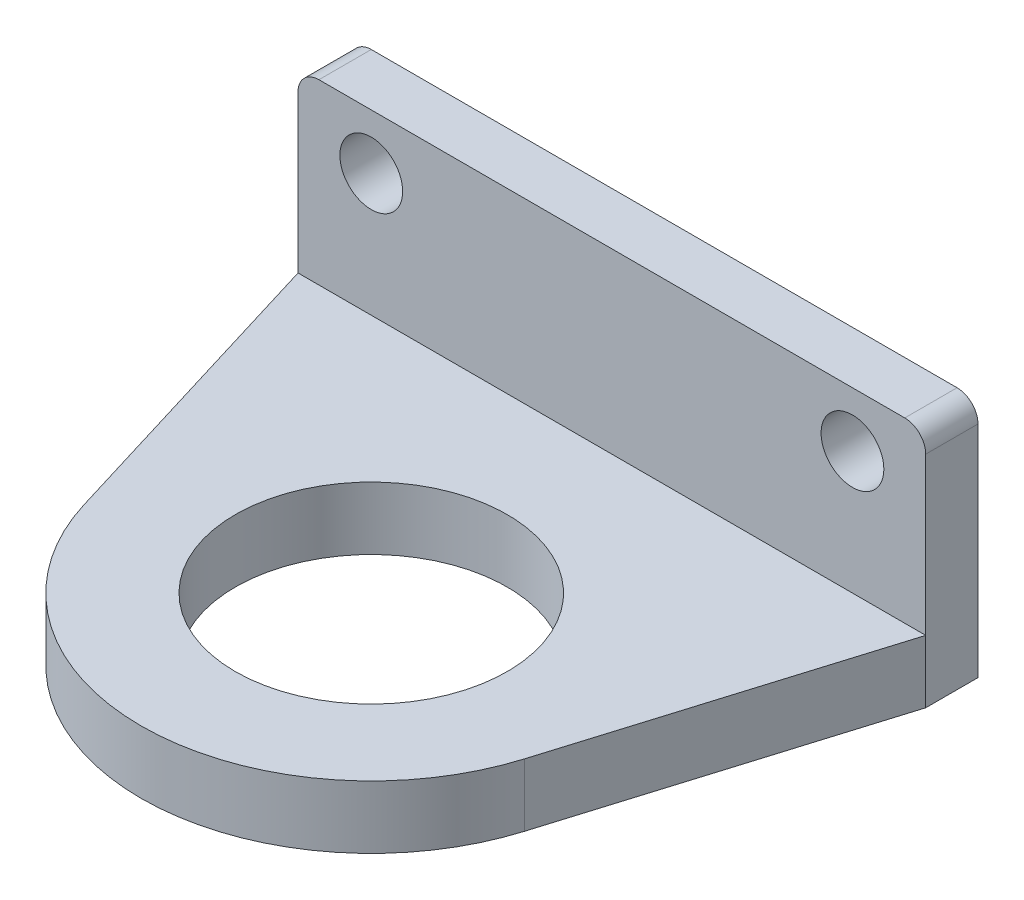
ISO-10303-21;
HEADER;
FILE_DESCRIPTION(('STEP AP214'),'2;1');
FILE_NAME('part.step','',(''),(''),'','','');
FILE_SCHEMA(('AUTOMOTIVE_DESIGN { 1 0 10303 214 1 1 1 1 }'));
ENDSEC;
DATA;
#1=APPLICATION_CONTEXT('core data for automotive mechanical design processes');
#2=APPLICATION_PROTOCOL_DEFINITION('international standard','automotive_design',2000,#1);
#3=PRODUCT_CONTEXT('',#1,'mechanical');
#4=PRODUCT('Part','Part','',(#3));
#5=PRODUCT_RELATED_PRODUCT_CATEGORY('part','',(#4));
#6=PRODUCT_DEFINITION_FORMATION('','',#4);
#7=PRODUCT_DEFINITION_CONTEXT('part definition',#1,'design');
#8=PRODUCT_DEFINITION('design','',#6,#7);
#9=PRODUCT_DEFINITION_SHAPE('','',#8);
#10=(LENGTH_UNIT() NAMED_UNIT(*) SI_UNIT(.MILLI.,.METRE.));
#11=(NAMED_UNIT(*) PLANE_ANGLE_UNIT() SI_UNIT($,.RADIAN.));
#12=(NAMED_UNIT(*) SI_UNIT($,.STERADIAN.) SOLID_ANGLE_UNIT());
#13=UNCERTAINTY_MEASURE_WITH_UNIT(LENGTH_MEASURE(1.E-05),#10,'distance_accuracy_value','');
#14=(GEOMETRIC_REPRESENTATION_CONTEXT(3) GLOBAL_UNCERTAINTY_ASSIGNED_CONTEXT((#13)) GLOBAL_UNIT_ASSIGNED_CONTEXT((#10,
#11,#12)) REPRESENTATION_CONTEXT('',''));
#15=CARTESIAN_POINT('',(0.,0.,0.));
#16=DIRECTION('',(0.,0.,1.));
#17=DIRECTION('',(1.,0.,0.));
#18=AXIS2_PLACEMENT_3D('',#15,#16,#17);
#19=CARTESIAN_POINT('',(-15.,-3.,0.));
#20=DIRECTION('',(-1.,0.,0.));
#21=DIRECTION('',(0.,0.,1.));
#22=AXIS2_PLACEMENT_3D('',#19,#20,#21);
#23=PLANE('',#22);
#24=DIRECTION('',(0.,-1.,0.));
#25=VECTOR('',#24,1.);
#26=CARTESIAN_POINT('',(-15.,8.5,2.5));
#27=LINE('',#26,#25);
#28=CARTESIAN_POINT('',(-15.,7.5,2.5));
#29=VERTEX_POINT('',#28);
#30=CARTESIAN_POINT('',(-15.,0.,2.5));
#31=VERTEX_POINT('',#30);
#32=EDGE_CURVE('E110',#29,#31,#27,.T.);
#33=ORIENTED_EDGE('',*,*,#32,.F.);
#34=DIRECTION('',(0.,0.,1.));
#35=VECTOR('',#34,1.);
#36=CARTESIAN_POINT('',(-15.,7.5,0.));
#37=LINE('',#36,#35);
#38=CARTESIAN_POINT('',(-15.,7.5,0.));
#39=VERTEX_POINT('',#38);
#40=EDGE_CURVE('E11',#29,#39,#37,.F.);
#41=ORIENTED_EDGE('',*,*,#40,.T.);
#42=DIRECTION('',(0.,1.,0.));
#43=VECTOR('',#42,1.);
#44=CARTESIAN_POINT('',(-15.,-3.,0.));
#45=LINE('',#44,#43);
#46=CARTESIAN_POINT('',(-15.,-3.,0.));
#47=VERTEX_POINT('',#46);
#48=EDGE_CURVE('E171',#47,#39,#45,.T.);
#49=ORIENTED_EDGE('',*,*,#48,.F.);
#50=DIRECTION('',(0.,0.,1.));
#51=VECTOR('',#50,1.);
#52=CARTESIAN_POINT('',(-15.,-3.,0.));
#53=LINE('',#52,#51);
#54=CARTESIAN_POINT('',(-15.,-3.,2.5));
#55=VERTEX_POINT('',#54);
#56=EDGE_CURVE('E126',#47,#55,#53,.T.);
#57=ORIENTED_EDGE('',*,*,#56,.T.);
#58=DIRECTION('',(0.,1.,0.));
#59=VECTOR('',#58,1.);
#60=CARTESIAN_POINT('',(-15.,-3.,2.5));
#61=LINE('',#60,#59);
#62=EDGE_CURVE('E168',#55,#31,#61,.T.);
#63=ORIENTED_EDGE('',*,*,#62,.T.);
#64=EDGE_LOOP('',(#33,#41,#49,#57,#63));
#65=FACE_BOUND('',#64,.T.);
#66=ADVANCED_FACE('F33',(#65),#23,.T.);
#67=CARTESIAN_POINT('',(-15.,-3.,0.));
#68=DIRECTION('',(0.,0.,-1.));
#69=DIRECTION('',(-1.,0.,0.));
#70=AXIS2_PLACEMENT_3D('',#67,#68,#69);
#71=PLANE('',#70);
#72=CARTESIAN_POINT('',(-11.5,5.8746423976288,0.));
#73=DIRECTION('',(0.,0.,-1.));
#74=DIRECTION('',(-1.,0.,0.));
#75=AXIS2_PLACEMENT_3D('',#72,#73,#74);
#76=CIRCLE('',#75,1.5);
#77=CARTESIAN_POINT('',(-13.,5.8746423976288,0.));
#78=VERTEX_POINT('',#77);
#79=EDGE_CURVE('E353',#78,#78,#76,.F.);
#80=ORIENTED_EDGE('',*,*,#79,.T.);
#81=EDGE_LOOP('',(#80));
#82=FACE_BOUND('',#81,.T.);
#83=CARTESIAN_POINT('',(11.5,5.8746423976288,0.));
#84=DIRECTION('',(0.,0.,-1.));
#85=DIRECTION('',(-1.,0.,0.));
#86=AXIS2_PLACEMENT_3D('',#83,#84,#85);
#87=CIRCLE('',#86,1.5);
#88=CARTESIAN_POINT('',(10.,5.8746423976288,0.));
#89=VERTEX_POINT('',#88);
#90=EDGE_CURVE('E137',#89,#89,#87,.T.);
#91=ORIENTED_EDGE('',*,*,#90,.F.);
#92=EDGE_LOOP('',(#91));
#93=FACE_BOUND('',#92,.T.);
#94=DIRECTION('',(-1.,0.,0.));
#95=VECTOR('',#94,1.);
#96=CARTESIAN_POINT('',(-15.,8.5,0.));
#97=LINE('',#96,#95);
#98=CARTESIAN_POINT('',(14.,8.5,0.));
#99=VERTEX_POINT('',#98);
#100=CARTESIAN_POINT('',(-14.,8.5,0.));
#101=VERTEX_POINT('',#100);
#102=EDGE_CURVE('E136',#99,#101,#97,.T.);
#103=ORIENTED_EDGE('',*,*,#102,.F.);
#104=CARTESIAN_POINT('',(14.,7.5,0.));
#105=DIRECTION('',(0.,0.,-1.));
#106=DIRECTION('',(-1.,0.,0.));
#107=AXIS2_PLACEMENT_3D('',#104,#105,#106);
#108=CIRCLE('',#107,1.);
#109=CARTESIAN_POINT('',(15.,7.5,0.));
#110=VERTEX_POINT('',#109);
#111=EDGE_CURVE('E187',#99,#110,#108,.T.);
#112=ORIENTED_EDGE('',*,*,#111,.T.);
#113=DIRECTION('',(0.,1.,0.));
#114=VECTOR('',#113,1.);
#115=CARTESIAN_POINT('',(15.,-3.,0.));
#116=LINE('',#115,#114);
#117=CARTESIAN_POINT('',(15.,-3.,0.));
#118=VERTEX_POINT('',#117);
#119=EDGE_CURVE('E132',#118,#110,#116,.T.);
#120=ORIENTED_EDGE('',*,*,#119,.F.);
#121=DIRECTION('',(-1.,0.,0.));
#122=VECTOR('',#121,1.);
#123=CARTESIAN_POINT('',(-15.,-3.,0.));
#124=LINE('',#123,#122);
#125=EDGE_CURVE('E165',#118,#47,#124,.T.);
#126=ORIENTED_EDGE('',*,*,#125,.T.);
#127=ORIENTED_EDGE('',*,*,#48,.T.);
#128=CARTESIAN_POINT('',(-14.,7.5,0.));
#129=DIRECTION('',(0.,0.,-1.));
#130=DIRECTION('',(-1.,0.,0.));
#131=AXIS2_PLACEMENT_3D('',#128,#129,#130);
#132=CIRCLE('',#131,1.);
#133=EDGE_CURVE('E185',#39,#101,#132,.T.);
#134=ORIENTED_EDGE('',*,*,#133,.T.);
#135=EDGE_LOOP('',(#103,#112,#120,#126,#127,#134));
#136=FACE_BOUND('',#135,.T.);
#137=ADVANCED_FACE('F199',(#82,#93,#136),#71,.T.);
#138=CARTESIAN_POINT('',(15.,-3.,0.));
#139=DIRECTION('',(1.,0.,0.));
#140=DIRECTION('',(0.,0.,-1.));
#141=AXIS2_PLACEMENT_3D('',#138,#139,#140);
#142=PLANE('',#141);
#143=ORIENTED_EDGE('',*,*,#119,.T.);
#144=DIRECTION('',(0.,0.,-1.));
#145=VECTOR('',#144,1.);
#146=CARTESIAN_POINT('',(15.,7.5,2.5));
#147=LINE('',#146,#145);
#148=CARTESIAN_POINT('',(15.,7.5,2.5));
#149=VERTEX_POINT('',#148);
#150=EDGE_CURVE('E56',#110,#149,#147,.F.);
#151=ORIENTED_EDGE('',*,*,#150,.T.);
#152=DIRECTION('',(0.,-1.,0.));
#153=VECTOR('',#152,1.);
#154=CARTESIAN_POINT('',(15.,8.5,2.5));
#155=LINE('',#154,#153);
#156=CARTESIAN_POINT('',(15.,0.,2.5));
#157=VERTEX_POINT('',#156);
#158=EDGE_CURVE('E101',#149,#157,#155,.T.);
#159=ORIENTED_EDGE('',*,*,#158,.T.);
#160=DIRECTION('',(0.,1.,0.));
#161=VECTOR('',#160,1.);
#162=CARTESIAN_POINT('',(15.,-3.,2.5));
#163=LINE('',#162,#161);
#164=CARTESIAN_POINT('',(15.,-3.,2.5));
#165=VERTEX_POINT('',#164);
#166=EDGE_CURVE('E106',#165,#157,#163,.T.);
#167=ORIENTED_EDGE('',*,*,#166,.F.);
#168=DIRECTION('',(0.,0.,-1.));
#169=VECTOR('',#168,1.);
#170=CARTESIAN_POINT('',(15.,-3.,0.));
#171=LINE('',#170,#169);
#172=EDGE_CURVE('E163',#165,#118,#171,.T.);
#173=ORIENTED_EDGE('',*,*,#172,.T.);
#174=EDGE_LOOP('',(#143,#151,#159,#167,#173));
#175=FACE_BOUND('',#174,.T.);
#176=ADVANCED_FACE('F103',(#175),#142,.T.);
#177=CARTESIAN_POINT('',(15.,-3.,2.5));
#178=DIRECTION('',(0.956640729776915,0.,0.291270517100325));
#179=DIRECTION('',(0.291270517100325,0.,-0.956640729776915));
#180=AXIS2_PLACEMENT_3D('',#177,#178,#179);
#181=PLANE('',#180);
#182=DIRECTION('',(0.291270517100325,0.,-0.956640729776915));
#183=VECTOR('',#182,1.);
#184=CARTESIAN_POINT('',(15.,0.,2.5));
#185=LINE('',#184,#183);
#186=CARTESIAN_POINT('',(10.5230480275461,0.,17.2039756881036));
#187=VERTEX_POINT('',#186);
#188=EDGE_CURVE('E117',#187,#157,#185,.T.);
#189=ORIENTED_EDGE('',*,*,#188,.F.);
#190=DIRECTION('',(0.,1.,0.));
#191=VECTOR('',#190,1.);
#192=CARTESIAN_POINT('',(10.5230480275461,-3.,17.2039756881036));
#193=LINE('',#192,#191);
#194=CARTESIAN_POINT('',(10.5230480275461,-3.,17.2039756881036));
#195=VERTEX_POINT('',#194);
#196=EDGE_CURVE('E133',#195,#187,#193,.T.);
#197=ORIENTED_EDGE('',*,*,#196,.F.);
#198=DIRECTION('',(0.291270517100325,0.,-0.956640729776915));
#199=VECTOR('',#198,1.);
#200=CARTESIAN_POINT('',(15.,-3.,2.5));
#201=LINE('',#200,#199);
#202=EDGE_CURVE('E131',#195,#165,#201,.T.);
#203=ORIENTED_EDGE('',*,*,#202,.T.);
#204=ORIENTED_EDGE('',*,*,#166,.T.);
#205=EDGE_LOOP('',(#189,#197,#203,#204));
#206=FACE_BOUND('',#205,.T.);
#207=ADVANCED_FACE('F129',(#206),#181,.T.);
#208=CARTESIAN_POINT('',(0.,-3.,14.));
#209=DIRECTION('',(0.,1.,0.));
#210=DIRECTION('',(0.,0.,1.));
#211=AXIS2_PLACEMENT_3D('',#208,#209,#210);
#212=CYLINDRICAL_SURFACE('',#211,11.);
#213=CARTESIAN_POINT('',(0.,0.,14.));
#214=DIRECTION('',(0.,1.,0.));
#215=DIRECTION('',(0.,0.,1.));
#216=AXIS2_PLACEMENT_3D('',#213,#214,#215);
#217=CIRCLE('',#216,11.);
#218=CARTESIAN_POINT('',(-10.5230480275461,0.,17.2039756881036));
#219=VERTEX_POINT('',#218);
#220=EDGE_CURVE('E124',#219,#187,#217,.T.);
#221=ORIENTED_EDGE('',*,*,#220,.F.);
#222=DIRECTION('',(0.,1.,0.));
#223=VECTOR('',#222,1.);
#224=CARTESIAN_POINT('',(-10.5230480275461,-3.,17.2039756881036));
#225=LINE('',#224,#223);
#226=CARTESIAN_POINT('',(-10.5230480275461,-3.,17.2039756881036));
#227=VERTEX_POINT('',#226);
#228=EDGE_CURVE('E177',#227,#219,#225,.T.);
#229=ORIENTED_EDGE('',*,*,#228,.F.);
#230=CARTESIAN_POINT('',(0.,-3.,14.));
#231=DIRECTION('',(0.,1.,0.));
#232=DIRECTION('',(0.,0.,1.));
#233=AXIS2_PLACEMENT_3D('',#230,#231,#232);
#234=CIRCLE('',#233,11.);
#235=EDGE_CURVE('E159',#227,#195,#234,.T.);
#236=ORIENTED_EDGE('',*,*,#235,.T.);
#237=ORIENTED_EDGE('',*,*,#196,.T.);
#238=EDGE_LOOP('',(#221,#229,#236,#237));
#239=FACE_BOUND('',#238,.T.);
#240=ADVANCED_FACE('F214',(#239),#212,.T.);
#241=CARTESIAN_POINT('',(-15.,-3.,2.5));
#242=DIRECTION('',(-0.956640729776915,0.,0.291270517100325));
#243=DIRECTION('',(0.291270517100325,0.,0.956640729776915));
#244=AXIS2_PLACEMENT_3D('',#241,#242,#243);
#245=PLANE('',#244);
#246=DIRECTION('',(0.291270517100325,0.,0.956640729776915));
#247=VECTOR('',#246,1.);
#248=CARTESIAN_POINT('',(-15.,0.,2.5));
#249=LINE('',#248,#247);
#250=EDGE_CURVE('E151',#31,#219,#249,.T.);
#251=ORIENTED_EDGE('',*,*,#250,.F.);
#252=ORIENTED_EDGE('',*,*,#62,.F.);
#253=DIRECTION('',(0.291270517100325,0.,0.956640729776915));
#254=VECTOR('',#253,1.);
#255=CARTESIAN_POINT('',(-15.,-3.,2.5));
#256=LINE('',#255,#254);
#257=EDGE_CURVE('E156',#55,#227,#256,.T.);
#258=ORIENTED_EDGE('',*,*,#257,.T.);
#259=ORIENTED_EDGE('',*,*,#228,.T.);
#260=EDGE_LOOP('',(#251,#252,#258,#259));
#261=FACE_BOUND('',#260,.T.);
#262=ADVANCED_FACE('F211',(#261),#245,.T.);
#263=CARTESIAN_POINT('',(0.,-3.,14.));
#264=DIRECTION('',(0.,1.,0.));
#265=DIRECTION('',(0.,0.,1.));
#266=AXIS2_PLACEMENT_3D('',#263,#264,#265);
#267=PLANE('',#266);
#268=CARTESIAN_POINT('',(0.,-3.,14.));
#269=DIRECTION('',(0.,1.,0.));
#270=DIRECTION('',(0.,0.,1.));
#271=AXIS2_PLACEMENT_3D('',#268,#269,#270);
#272=CIRCLE('',#271,6.50000000000001);
#273=CARTESIAN_POINT('',(0.,-3.,20.5));
#274=VERTEX_POINT('',#273);
#275=EDGE_CURVE('E148',#274,#274,#272,.T.);
#276=ORIENTED_EDGE('',*,*,#275,.T.);
#277=EDGE_LOOP('',(#276));
#278=FACE_BOUND('',#277,.T.);
#279=ORIENTED_EDGE('',*,*,#56,.F.);
#280=ORIENTED_EDGE('',*,*,#125,.F.);
#281=ORIENTED_EDGE('',*,*,#172,.F.);
#282=ORIENTED_EDGE('',*,*,#202,.F.);
#283=ORIENTED_EDGE('',*,*,#235,.F.);
#284=ORIENTED_EDGE('',*,*,#257,.F.);
#285=EDGE_LOOP('',(#279,#280,#281,#282,#283,#284));
#286=FACE_BOUND('',#285,.T.);
#287=ADVANCED_FACE('F203',(#278,#286),#267,.F.);
#288=CARTESIAN_POINT('',(0.,0.,14.));
#289=DIRECTION('',(0.,1.,0.));
#290=DIRECTION('',(0.,0.,1.));
#291=AXIS2_PLACEMENT_3D('',#288,#289,#290);
#292=PLANE('',#291);
#293=DIRECTION('',(1.,0.,0.));
#294=VECTOR('',#293,1.);
#295=CARTESIAN_POINT('',(-15.,0.,2.5));
#296=LINE('',#295,#294);
#297=EDGE_CURVE('E121',#31,#157,#296,.T.);
#298=ORIENTED_EDGE('',*,*,#297,.F.);
#299=ORIENTED_EDGE('',*,*,#250,.T.);
#300=ORIENTED_EDGE('',*,*,#220,.T.);
#301=ORIENTED_EDGE('',*,*,#188,.T.);
#302=EDGE_LOOP('',(#298,#299,#300,#301));
#303=FACE_BOUND('',#302,.T.);
#304=CARTESIAN_POINT('',(0.,0.,14.));
#305=DIRECTION('',(0.,1.,0.));
#306=DIRECTION('',(0.,0.,1.));
#307=AXIS2_PLACEMENT_3D('',#304,#305,#306);
#308=CIRCLE('',#307,6.50000000000001);
#309=CARTESIAN_POINT('',(0.,0.,20.5));
#310=VERTEX_POINT('',#309);
#311=EDGE_CURVE('E147',#310,#310,#308,.T.);
#312=ORIENTED_EDGE('',*,*,#311,.F.);
#313=EDGE_LOOP('',(#312));
#314=FACE_BOUND('',#313,.T.);
#315=ADVANCED_FACE('F118',(#303,#314),#292,.T.);
#316=CARTESIAN_POINT('',(0.,-3.,14.));
#317=DIRECTION('',(0.,1.,0.));
#318=DIRECTION('',(0.,0.,1.));
#319=AXIS2_PLACEMENT_3D('',#316,#317,#318);
#320=CYLINDRICAL_SURFACE('',#319,6.50000000000001);
#321=ORIENTED_EDGE('',*,*,#275,.F.);
#322=EDGE_LOOP('',(#321));
#323=FACE_BOUND('',#322,.T.);
#324=ORIENTED_EDGE('',*,*,#311,.T.);
#325=EDGE_LOOP('',(#324));
#326=FACE_BOUND('',#325,.T.);
#327=ADVANCED_FACE('F240',(#323,#326),#320,.F.);
#328=CARTESIAN_POINT('',(-15.,8.5,2.5));
#329=DIRECTION('',(0.,0.,-1.));
#330=DIRECTION('',(-1.,0.,0.));
#331=AXIS2_PLACEMENT_3D('',#328,#329,#330);
#332=PLANE('',#331);
#333=CARTESIAN_POINT('',(-11.5,5.8746423976288,2.5));
#334=DIRECTION('',(0.,0.,-1.));
#335=DIRECTION('',(-1.,0.,0.));
#336=AXIS2_PLACEMENT_3D('',#333,#334,#335);
#337=CIRCLE('',#336,1.5);
#338=CARTESIAN_POINT('',(-13.,5.8746423976288,2.5));
#339=VERTEX_POINT('',#338);
#340=EDGE_CURVE('E356',#339,#339,#337,.T.);
#341=ORIENTED_EDGE('',*,*,#340,.T.);
#342=EDGE_LOOP('',(#341));
#343=FACE_BOUND('',#342,.T.);
#344=CARTESIAN_POINT('',(11.5,5.8746423976288,2.5));
#345=DIRECTION('',(0.,0.,1.));
#346=DIRECTION('',(1.,0.,0.));
#347=AXIS2_PLACEMENT_3D('',#344,#345,#346);
#348=CIRCLE('',#347,1.5);
#349=CARTESIAN_POINT('',(13.,5.8746423976288,2.5));
#350=VERTEX_POINT('',#349);
#351=EDGE_CURVE('E142',#350,#350,#348,.T.);
#352=ORIENTED_EDGE('',*,*,#351,.F.);
#353=EDGE_LOOP('',(#352));
#354=FACE_BOUND('',#353,.T.);
#355=ORIENTED_EDGE('',*,*,#158,.F.);
#356=CARTESIAN_POINT('',(14.,7.5,2.5));
#357=DIRECTION('',(0.,0.,-1.));
#358=DIRECTION('',(-1.,0.,0.));
#359=AXIS2_PLACEMENT_3D('',#356,#357,#358);
#360=CIRCLE('',#359,1.);
#361=CARTESIAN_POINT('',(14.,8.5,2.5));
#362=VERTEX_POINT('',#361);
#363=EDGE_CURVE('E41',#149,#362,#360,.F.);
#364=ORIENTED_EDGE('',*,*,#363,.T.);
#365=DIRECTION('',(1.,0.,0.));
#366=VECTOR('',#365,1.);
#367=CARTESIAN_POINT('',(-15.,8.5,2.5));
#368=LINE('',#367,#366);
#369=CARTESIAN_POINT('',(-14.,8.5,2.5));
#370=VERTEX_POINT('',#369);
#371=EDGE_CURVE('E111',#370,#362,#368,.T.);
#372=ORIENTED_EDGE('',*,*,#371,.F.);
#373=CARTESIAN_POINT('',(-14.,7.5,2.5));
#374=DIRECTION('',(0.,0.,-1.));
#375=DIRECTION('',(-1.,0.,0.));
#376=AXIS2_PLACEMENT_3D('',#373,#374,#375);
#377=CIRCLE('',#376,1.);
#378=EDGE_CURVE('E48',#370,#29,#377,.F.);
#379=ORIENTED_EDGE('',*,*,#378,.T.);
#380=ORIENTED_EDGE('',*,*,#32,.T.);
#381=ORIENTED_EDGE('',*,*,#297,.T.);
#382=EDGE_LOOP('',(#355,#364,#372,#379,#380,#381));
#383=FACE_BOUND('',#382,.T.);
#384=ADVANCED_FACE('F135',(#343,#354,#383),#332,.F.);
#385=CARTESIAN_POINT('',(0.,8.5,0.));
#386=DIRECTION('',(0.,-1.,0.));
#387=DIRECTION('',(0.,0.,-1.));
#388=AXIS2_PLACEMENT_3D('',#385,#386,#387);
#389=PLANE('',#388);
#390=ORIENTED_EDGE('',*,*,#371,.T.);
#391=DIRECTION('',(0.,0.,-1.));
#392=VECTOR('',#391,1.);
#393=CARTESIAN_POINT('',(14.,8.5,0.));
#394=LINE('',#393,#392);
#395=EDGE_CURVE('E182',#362,#99,#394,.T.);
#396=ORIENTED_EDGE('',*,*,#395,.T.);
#397=ORIENTED_EDGE('',*,*,#102,.T.);
#398=DIRECTION('',(0.,0.,1.));
#399=VECTOR('',#398,1.);
#400=CARTESIAN_POINT('',(-14.,8.5,2.5));
#401=LINE('',#400,#399);
#402=EDGE_CURVE('E174',#101,#370,#401,.T.);
#403=ORIENTED_EDGE('',*,*,#402,.T.);
#404=EDGE_LOOP('',(#390,#396,#397,#403));
#405=FACE_BOUND('',#404,.T.);
#406=ADVANCED_FACE('F194',(#405),#389,.F.);
#407=CARTESIAN_POINT('',(14.,7.5,0.));
#408=DIRECTION('',(0.,0.,1.));
#409=DIRECTION('',(1.,0.,0.));
#410=AXIS2_PLACEMENT_3D('',#407,#408,#409);
#411=CYLINDRICAL_SURFACE('',#410,1.);
#412=ORIENTED_EDGE('',*,*,#363,.F.);
#413=ORIENTED_EDGE('',*,*,#150,.F.);
#414=ORIENTED_EDGE('',*,*,#111,.F.);
#415=ORIENTED_EDGE('',*,*,#395,.F.);
#416=EDGE_LOOP('',(#412,#413,#414,#415));
#417=FACE_BOUND('',#416,.T.);
#418=ADVANCED_FACE('F197',(#417),#411,.T.);
#419=CARTESIAN_POINT('',(-14.,7.5,0.));
#420=DIRECTION('',(0.,0.,-1.));
#421=DIRECTION('',(-1.,0.,0.));
#422=AXIS2_PLACEMENT_3D('',#419,#420,#421);
#423=CYLINDRICAL_SURFACE('',#422,1.);
#424=ORIENTED_EDGE('',*,*,#133,.F.);
#425=ORIENTED_EDGE('',*,*,#40,.F.);
#426=ORIENTED_EDGE('',*,*,#378,.F.);
#427=ORIENTED_EDGE('',*,*,#402,.F.);
#428=EDGE_LOOP('',(#424,#425,#426,#427));
#429=FACE_BOUND('',#428,.T.);
#430=ADVANCED_FACE('F35',(#429),#423,.T.);
#431=CARTESIAN_POINT('',(11.5,5.8746423976288,-6.));
#432=DIRECTION('',(0.,0.,1.));
#433=DIRECTION('',(1.,0.,0.));
#434=AXIS2_PLACEMENT_3D('',#431,#432,#433);
#435=CYLINDRICAL_SURFACE('',#434,1.5);
#436=ORIENTED_EDGE('',*,*,#90,.T.);
#437=EDGE_LOOP('',(#436));
#438=FACE_BOUND('',#437,.T.);
#439=ORIENTED_EDGE('',*,*,#351,.T.);
#440=EDGE_LOOP('',(#439));
#441=FACE_BOUND('',#440,.T.);
#442=ADVANCED_FACE('F235',(#438,#441),#435,.F.);
#443=CARTESIAN_POINT('',(-11.5,5.8746423976288,-6.));
#444=DIRECTION('',(0.,0.,1.));
#445=DIRECTION('',(1.,0.,0.));
#446=AXIS2_PLACEMENT_3D('',#443,#444,#445);
#447=CYLINDRICAL_SURFACE('',#446,1.5);
#448=ORIENTED_EDGE('',*,*,#79,.F.);
#449=EDGE_LOOP('',(#448));
#450=FACE_BOUND('',#449,.T.);
#451=ORIENTED_EDGE('',*,*,#340,.F.);
#452=EDGE_LOOP('',(#451));
#453=FACE_BOUND('',#452,.T.);
#454=ADVANCED_FACE('F339',(#450,#453),#447,.F.);
#455=CLOSED_SHELL('',(#66,#137,#176,#207,#240,#262,#287,#315,#327,#384,#406,#418,#430,#442,#454));
#456=MANIFOLD_SOLID_BREP('B2',#455);
#457=ADVANCED_BREP_SHAPE_REPRESENTATION('',(#18,#456),#14);
#458=SHAPE_DEFINITION_REPRESENTATION(#9,#457);
ENDSEC;
END-ISO-10303-21;
